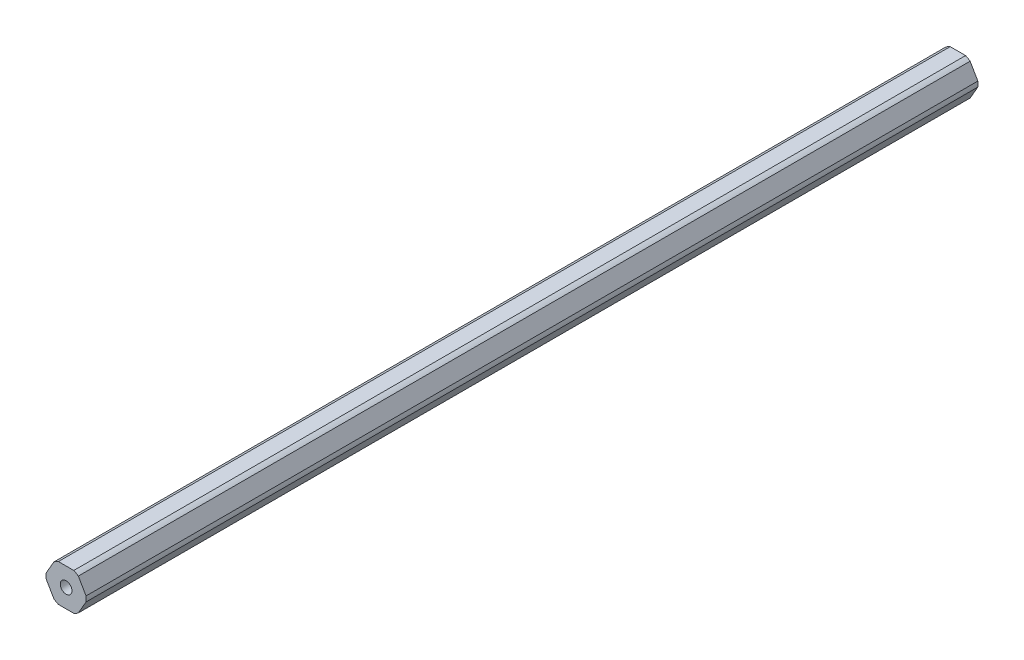
ISO-10303-21;
HEADER;
FILE_DESCRIPTION(('STEP AP214'),'2;1');
FILE_NAME('part.step','',(''),(''),'','','');
FILE_SCHEMA(('AUTOMOTIVE_DESIGN { 1 0 10303 214 1 1 1 1 }'));
ENDSEC;
DATA;
#1=APPLICATION_CONTEXT('core data for automotive mechanical design processes');
#2=APPLICATION_PROTOCOL_DEFINITION('international standard','automotive_design',2000,#1);
#3=PRODUCT_CONTEXT('',#1,'mechanical');
#4=PRODUCT('Part','Part','',(#3));
#5=PRODUCT_RELATED_PRODUCT_CATEGORY('part','',(#4));
#6=PRODUCT_DEFINITION_FORMATION('','',#4);
#7=PRODUCT_DEFINITION_CONTEXT('part definition',#1,'design');
#8=PRODUCT_DEFINITION('design','',#6,#7);
#9=PRODUCT_DEFINITION_SHAPE('','',#8);
#10=(LENGTH_UNIT() NAMED_UNIT(*) SI_UNIT(.MILLI.,.METRE.));
#11=(NAMED_UNIT(*) PLANE_ANGLE_UNIT() SI_UNIT($,.RADIAN.));
#12=(NAMED_UNIT(*) SI_UNIT($,.STERADIAN.) SOLID_ANGLE_UNIT());
#13=UNCERTAINTY_MEASURE_WITH_UNIT(LENGTH_MEASURE(1.E-05),#10,'distance_accuracy_value','');
#14=(GEOMETRIC_REPRESENTATION_CONTEXT(3) GLOBAL_UNCERTAINTY_ASSIGNED_CONTEXT((#13)) GLOBAL_UNIT_ASSIGNED_CONTEXT((#10,
#11,#12)) REPRESENTATION_CONTEXT('',''));
#15=CARTESIAN_POINT('',(0.,0.,0.));
#16=DIRECTION('',(0.,0.,1.));
#17=DIRECTION('',(1.,0.,0.));
#18=AXIS2_PLACEMENT_3D('',#15,#16,#17);
#19=CARTESIAN_POINT('',(5.49926131403118,3.175,152.4));
#20=DIRECTION('',(-0.866025403784439,-0.5,0.));
#21=DIRECTION('',(0.5,-0.866025403784438,0.));
#22=AXIS2_PLACEMENT_3D('',#19,#20,#21);
#23=PLANE('',#22);
#24=DIRECTION('',(-0.5,0.866025403784439,0.));
#25=VECTOR('',#24,1.);
#26=CARTESIAN_POINT('',(5.49926131403118,3.175,-152.4));
#27=LINE('',#26,#25);
#28=CARTESIAN_POINT('',(6.81675178197583,0.89303957103218,-152.4));
#29=VERTEX_POINT('',#28);
#30=CARTESIAN_POINT('',(4.18177084608654,5.45696042896782,-152.4));
#31=VERTEX_POINT('',#30);
#32=EDGE_CURVE('E164',#29,#31,#27,.T.);
#33=ORIENTED_EDGE('',*,*,#32,.T.);
#34=DIRECTION('',(0.,0.,-1.));
#35=VECTOR('',#34,1.);
#36=CARTESIAN_POINT('',(4.18177084608654,5.45696042896782,152.4));
#37=LINE('',#36,#35);
#38=CARTESIAN_POINT('',(4.18177084608654,5.45696042896782,152.4));
#39=VERTEX_POINT('',#38);
#40=EDGE_CURVE('E11',#39,#31,#37,.T.);
#41=ORIENTED_EDGE('',*,*,#40,.F.);
#42=DIRECTION('',(-0.5,0.866025403784439,0.));
#43=VECTOR('',#42,1.);
#44=CARTESIAN_POINT('',(5.49926131403118,3.175,152.4));
#45=LINE('',#44,#43);
#46=CARTESIAN_POINT('',(6.81675178197583,0.89303957103218,152.4));
#47=VERTEX_POINT('',#46);
#48=EDGE_CURVE('E223',#47,#39,#45,.T.);
#49=ORIENTED_EDGE('',*,*,#48,.F.);
#50=DIRECTION('',(0.,0.,-1.));
#51=VECTOR('',#50,1.);
#52=CARTESIAN_POINT('',(6.81675178197583,0.89303957103218,152.4));
#53=LINE('',#52,#51);
#54=EDGE_CURVE('E157',#47,#29,#53,.T.);
#55=ORIENTED_EDGE('',*,*,#54,.T.);
#56=EDGE_LOOP('',(#33,#41,#49,#55));
#57=FACE_BOUND('',#56,.T.);
#58=ADVANCED_FACE('F39',(#57),#23,.F.);
#59=CARTESIAN_POINT('',(0.,0.,152.4));
#60=DIRECTION('',(0.,0.,-1.));
#61=DIRECTION('',(-1.,0.,0.));
#62=AXIS2_PLACEMENT_3D('',#59,#60,#61);
#63=CYLINDRICAL_SURFACE('',#62,6.874999966);
#64=CARTESIAN_POINT('',(0.,0.,-152.4));
#65=DIRECTION('',(0.,0.,1.));
#66=DIRECTION('',(1.,0.,0.));
#67=AXIS2_PLACEMENT_3D('',#64,#65,#66);
#68=CIRCLE('',#67,6.874999966);
#69=CARTESIAN_POINT('',(2.63498093588929,6.35,-152.4));
#70=VERTEX_POINT('',#69);
#71=EDGE_CURVE('E167',#31,#70,#68,.T.);
#72=ORIENTED_EDGE('',*,*,#71,.T.);
#73=DIRECTION('',(0.,0.,-1.));
#74=VECTOR('',#73,1.);
#75=CARTESIAN_POINT('',(2.63498093588929,6.35,152.4));
#76=LINE('',#75,#74);
#77=CARTESIAN_POINT('',(2.63498093588929,6.35,152.4));
#78=VERTEX_POINT('',#77);
#79=EDGE_CURVE('E48',#78,#70,#76,.T.);
#80=ORIENTED_EDGE('',*,*,#79,.F.);
#81=CARTESIAN_POINT('',(0.,0.,152.4));
#82=DIRECTION('',(0.,0.,1.));
#83=DIRECTION('',(1.,0.,0.));
#84=AXIS2_PLACEMENT_3D('',#81,#82,#83);
#85=CIRCLE('',#84,6.874999966);
#86=EDGE_CURVE('E111',#39,#78,#85,.T.);
#87=ORIENTED_EDGE('',*,*,#86,.F.);
#88=ORIENTED_EDGE('',*,*,#40,.T.);
#89=EDGE_LOOP('',(#72,#80,#87,#88));
#90=FACE_BOUND('',#89,.T.);
#91=ADVANCED_FACE('F258',(#90),#63,.T.);
#92=CARTESIAN_POINT('',(0.,6.35,152.4));
#93=DIRECTION('',(0.,-1.,0.));
#94=DIRECTION('',(0.,0.,-1.));
#95=AXIS2_PLACEMENT_3D('',#92,#93,#94);
#96=PLANE('',#95);
#97=DIRECTION('',(-1.,0.,0.));
#98=VECTOR('',#97,1.);
#99=CARTESIAN_POINT('',(0.,6.35,-152.4));
#100=LINE('',#99,#98);
#101=CARTESIAN_POINT('',(-2.63498093588929,6.35,-152.4));
#102=VERTEX_POINT('',#101);
#103=EDGE_CURVE('E169',#70,#102,#100,.T.);
#104=ORIENTED_EDGE('',*,*,#103,.T.);
#105=DIRECTION('',(0.,0.,-1.));
#106=VECTOR('',#105,1.);
#107=CARTESIAN_POINT('',(-2.63498093588929,6.35,152.4));
#108=LINE('',#107,#106);
#109=CARTESIAN_POINT('',(-2.63498093588929,6.35,152.4));
#110=VERTEX_POINT('',#109);
#111=EDGE_CURVE('E199',#110,#102,#108,.T.);
#112=ORIENTED_EDGE('',*,*,#111,.F.);
#113=DIRECTION('',(-1.,0.,0.));
#114=VECTOR('',#113,1.);
#115=CARTESIAN_POINT('',(0.,6.35,152.4));
#116=LINE('',#115,#114);
#117=EDGE_CURVE('E207',#78,#110,#116,.T.);
#118=ORIENTED_EDGE('',*,*,#117,.F.);
#119=ORIENTED_EDGE('',*,*,#79,.T.);
#120=EDGE_LOOP('',(#104,#112,#118,#119));
#121=FACE_BOUND('',#120,.T.);
#122=ADVANCED_FACE('F205',(#121),#96,.F.);
#123=CARTESIAN_POINT('',(-4.18177084608654,5.45696042896783,-152.4));
#124=VERTEX_POINT('',#123);
#125=EDGE_CURVE('E170',#102,#124,#68,.T.);
#126=ORIENTED_EDGE('',*,*,#125,.T.);
#127=DIRECTION('',(0.,0.,-1.));
#128=VECTOR('',#127,1.);
#129=CARTESIAN_POINT('',(-4.18177084608654,5.45696042896783,152.4));
#130=LINE('',#129,#128);
#131=CARTESIAN_POINT('',(-4.18177084608654,5.45696042896783,152.4));
#132=VERTEX_POINT('',#131);
#133=EDGE_CURVE('E196',#132,#124,#130,.T.);
#134=ORIENTED_EDGE('',*,*,#133,.F.);
#135=EDGE_CURVE('E229',#110,#132,#85,.T.);
#136=ORIENTED_EDGE('',*,*,#135,.F.);
#137=ORIENTED_EDGE('',*,*,#111,.T.);
#138=EDGE_LOOP('',(#126,#134,#136,#137));
#139=FACE_BOUND('',#138,.T.);
#140=ADVANCED_FACE('F240',(#139),#63,.T.);
#141=CARTESIAN_POINT('',(-5.49926131403118,3.175,152.4));
#142=DIRECTION('',(0.866025403784438,-0.5,0.));
#143=DIRECTION('',(0.5,0.866025403784438,0.));
#144=AXIS2_PLACEMENT_3D('',#141,#142,#143);
#145=PLANE('',#144);
#146=DIRECTION('',(-0.5,-0.866025403784438,0.));
#147=VECTOR('',#146,1.);
#148=CARTESIAN_POINT('',(-5.49926131403118,3.175,-152.4));
#149=LINE('',#148,#147);
#150=CARTESIAN_POINT('',(-6.81675178197583,0.893039571032178,-152.4));
#151=VERTEX_POINT('',#150);
#152=EDGE_CURVE('E172',#124,#151,#149,.T.);
#153=ORIENTED_EDGE('',*,*,#152,.T.);
#154=DIRECTION('',(0.,0.,-1.));
#155=VECTOR('',#154,1.);
#156=CARTESIAN_POINT('',(-6.81675178197583,0.893039571032178,152.4));
#157=LINE('',#156,#155);
#158=CARTESIAN_POINT('',(-6.81675178197583,0.893039571032178,152.4));
#159=VERTEX_POINT('',#158);
#160=EDGE_CURVE('E193',#159,#151,#157,.T.);
#161=ORIENTED_EDGE('',*,*,#160,.F.);
#162=DIRECTION('',(-0.5,-0.866025403784438,0.));
#163=VECTOR('',#162,1.);
#164=CARTESIAN_POINT('',(-5.49926131403118,3.175,152.4));
#165=LINE('',#164,#163);
#166=EDGE_CURVE('E231',#132,#159,#165,.T.);
#167=ORIENTED_EDGE('',*,*,#166,.F.);
#168=ORIENTED_EDGE('',*,*,#133,.T.);
#169=EDGE_LOOP('',(#153,#161,#167,#168));
#170=FACE_BOUND('',#169,.T.);
#171=ADVANCED_FACE('F242',(#170),#145,.F.);
#172=CARTESIAN_POINT('',(-6.81675178197583,-0.893039571032174,-152.4));
#173=VERTEX_POINT('',#172);
#174=EDGE_CURVE('E174',#151,#173,#68,.T.);
#175=ORIENTED_EDGE('',*,*,#174,.T.);
#176=DIRECTION('',(0.,0.,-1.));
#177=VECTOR('',#176,1.);
#178=CARTESIAN_POINT('',(-6.81675178197583,-0.893039571032174,152.4));
#179=LINE('',#178,#177);
#180=CARTESIAN_POINT('',(-6.81675178197583,-0.893039571032174,152.4));
#181=VERTEX_POINT('',#180);
#182=EDGE_CURVE('E190',#181,#173,#179,.T.);
#183=ORIENTED_EDGE('',*,*,#182,.F.);
#184=EDGE_CURVE('E232',#159,#181,#85,.T.);
#185=ORIENTED_EDGE('',*,*,#184,.F.);
#186=ORIENTED_EDGE('',*,*,#160,.T.);
#187=EDGE_LOOP('',(#175,#183,#185,#186));
#188=FACE_BOUND('',#187,.T.);
#189=ADVANCED_FACE('F243',(#188),#63,.T.);
#190=CARTESIAN_POINT('',(-5.49926131403118,-3.175,152.4));
#191=DIRECTION('',(0.866025403784438,0.5,0.));
#192=DIRECTION('',(-0.5,0.866025403784438,0.));
#193=AXIS2_PLACEMENT_3D('',#190,#191,#192);
#194=PLANE('',#193);
#195=DIRECTION('',(0.5,-0.866025403784438,0.));
#196=VECTOR('',#195,1.);
#197=CARTESIAN_POINT('',(-5.49926131403118,-3.175,-152.4));
#198=LINE('',#197,#196);
#199=CARTESIAN_POINT('',(-4.18177084608653,-5.45696042896783,-152.4));
#200=VERTEX_POINT('',#199);
#201=EDGE_CURVE('E175',#173,#200,#198,.T.);
#202=ORIENTED_EDGE('',*,*,#201,.T.);
#203=DIRECTION('',(0.,0.,-1.));
#204=VECTOR('',#203,1.);
#205=CARTESIAN_POINT('',(-4.18177084608653,-5.45696042896783,152.4));
#206=LINE('',#205,#204);
#207=CARTESIAN_POINT('',(-4.18177084608653,-5.45696042896783,152.4));
#208=VERTEX_POINT('',#207);
#209=EDGE_CURVE('E187',#208,#200,#206,.T.);
#210=ORIENTED_EDGE('',*,*,#209,.F.);
#211=DIRECTION('',(0.5,-0.866025403784438,0.));
#212=VECTOR('',#211,1.);
#213=CARTESIAN_POINT('',(-5.49926131403118,-3.175,152.4));
#214=LINE('',#213,#212);
#215=EDGE_CURVE('E233',#181,#208,#214,.T.);
#216=ORIENTED_EDGE('',*,*,#215,.F.);
#217=ORIENTED_EDGE('',*,*,#182,.T.);
#218=EDGE_LOOP('',(#202,#210,#216,#217));
#219=FACE_BOUND('',#218,.T.);
#220=ADVANCED_FACE('F246',(#219),#194,.F.);
#221=CARTESIAN_POINT('',(-2.6349809358893,-6.35,-152.4));
#222=VERTEX_POINT('',#221);
#223=EDGE_CURVE('E177',#200,#222,#68,.T.);
#224=ORIENTED_EDGE('',*,*,#223,.T.);
#225=DIRECTION('',(0.,0.,-1.));
#226=VECTOR('',#225,1.);
#227=CARTESIAN_POINT('',(-2.6349809358893,-6.35,152.4));
#228=LINE('',#227,#226);
#229=CARTESIAN_POINT('',(-2.6349809358893,-6.35,152.4));
#230=VERTEX_POINT('',#229);
#231=EDGE_CURVE('E184',#230,#222,#228,.T.);
#232=ORIENTED_EDGE('',*,*,#231,.F.);
#233=EDGE_CURVE('E147',#208,#230,#85,.T.);
#234=ORIENTED_EDGE('',*,*,#233,.F.);
#235=ORIENTED_EDGE('',*,*,#209,.T.);
#236=EDGE_LOOP('',(#224,#232,#234,#235));
#237=FACE_BOUND('',#236,.T.);
#238=ADVANCED_FACE('F248',(#237),#63,.T.);
#239=CARTESIAN_POINT('',(0.,-6.35,152.4));
#240=DIRECTION('',(0.,1.,0.));
#241=DIRECTION('',(0.,0.,1.));
#242=AXIS2_PLACEMENT_3D('',#239,#240,#241);
#243=PLANE('',#242);
#244=DIRECTION('',(1.,0.,0.));
#245=VECTOR('',#244,1.);
#246=CARTESIAN_POINT('',(0.,-6.35,-152.4));
#247=LINE('',#246,#245);
#248=CARTESIAN_POINT('',(2.6349809358893,-6.35,-152.4));
#249=VERTEX_POINT('',#248);
#250=EDGE_CURVE('E178',#222,#249,#247,.T.);
#251=ORIENTED_EDGE('',*,*,#250,.T.);
#252=DIRECTION('',(0.,0.,-1.));
#253=VECTOR('',#252,1.);
#254=CARTESIAN_POINT('',(2.6349809358893,-6.35,152.4));
#255=LINE('',#254,#253);
#256=CARTESIAN_POINT('',(2.6349809358893,-6.35,152.4));
#257=VERTEX_POINT('',#256);
#258=EDGE_CURVE('E152',#257,#249,#255,.T.);
#259=ORIENTED_EDGE('',*,*,#258,.F.);
#260=DIRECTION('',(1.,0.,0.));
#261=VECTOR('',#260,1.);
#262=CARTESIAN_POINT('',(0.,-6.35,152.4));
#263=LINE('',#262,#261);
#264=EDGE_CURVE('E142',#230,#257,#263,.T.);
#265=ORIENTED_EDGE('',*,*,#264,.F.);
#266=ORIENTED_EDGE('',*,*,#231,.T.);
#267=EDGE_LOOP('',(#251,#259,#265,#266));
#268=FACE_BOUND('',#267,.T.);
#269=ADVANCED_FACE('F251',(#268),#243,.F.);
#270=CARTESIAN_POINT('',(4.18177084608654,-5.45696042896782,-152.4));
#271=VERTEX_POINT('',#270);
#272=EDGE_CURVE('E151',#249,#271,#68,.T.);
#273=ORIENTED_EDGE('',*,*,#272,.T.);
#274=DIRECTION('',(0.,0.,-1.));
#275=VECTOR('',#274,1.);
#276=CARTESIAN_POINT('',(4.18177084608654,-5.45696042896782,152.4));
#277=LINE('',#276,#275);
#278=CARTESIAN_POINT('',(4.18177084608654,-5.45696042896782,152.4));
#279=VERTEX_POINT('',#278);
#280=EDGE_CURVE('E148',#279,#271,#277,.T.);
#281=ORIENTED_EDGE('',*,*,#280,.F.);
#282=EDGE_CURVE('E136',#257,#279,#85,.T.);
#283=ORIENTED_EDGE('',*,*,#282,.F.);
#284=ORIENTED_EDGE('',*,*,#258,.T.);
#285=EDGE_LOOP('',(#273,#281,#283,#284));
#286=FACE_BOUND('',#285,.T.);
#287=ADVANCED_FACE('F149',(#286),#63,.T.);
#288=CARTESIAN_POINT('',(5.49926131403119,-3.175,152.4));
#289=DIRECTION('',(-0.866025403784439,0.5,0.));
#290=DIRECTION('',(-0.5,-0.866025403784439,0.));
#291=AXIS2_PLACEMENT_3D('',#288,#289,#290);
#292=PLANE('',#291);
#293=DIRECTION('',(0.5,0.866025403784439,0.));
#294=VECTOR('',#293,1.);
#295=CARTESIAN_POINT('',(5.49926131403119,-3.175,-152.4));
#296=LINE('',#295,#294);
#297=CARTESIAN_POINT('',(6.81675178197583,-0.893039571032182,-152.4));
#298=VERTEX_POINT('',#297);
#299=EDGE_CURVE('E97',#271,#298,#296,.T.);
#300=ORIENTED_EDGE('',*,*,#299,.T.);
#301=DIRECTION('',(0.,0.,-1.));
#302=VECTOR('',#301,1.);
#303=CARTESIAN_POINT('',(6.81675178197583,-0.893039571032182,152.4));
#304=LINE('',#303,#302);
#305=CARTESIAN_POINT('',(6.81675178197583,-0.893039571032182,152.4));
#306=VERTEX_POINT('',#305);
#307=EDGE_CURVE('E153',#306,#298,#304,.T.);
#308=ORIENTED_EDGE('',*,*,#307,.F.);
#309=DIRECTION('',(0.5,0.866025403784439,0.));
#310=VECTOR('',#309,1.);
#311=CARTESIAN_POINT('',(5.49926131403119,-3.175,152.4));
#312=LINE('',#311,#310);
#313=EDGE_CURVE('E140',#279,#306,#312,.T.);
#314=ORIENTED_EDGE('',*,*,#313,.F.);
#315=ORIENTED_EDGE('',*,*,#280,.T.);
#316=EDGE_LOOP('',(#300,#308,#314,#315));
#317=FACE_BOUND('',#316,.T.);
#318=ADVANCED_FACE('F155',(#317),#292,.F.);
#319=CARTESIAN_POINT('',(0.,0.,152.4));
#320=DIRECTION('',(0.,0.,-1.));
#321=DIRECTION('',(-1.,0.,0.));
#322=AXIS2_PLACEMENT_3D('',#319,#320,#321);
#323=CYLINDRICAL_SURFACE('',#322,2.000000064);
#324=CARTESIAN_POINT('',(0.,0.,152.4));
#325=DIRECTION('',(0.,0.,1.));
#326=DIRECTION('',(1.,0.,0.));
#327=AXIS2_PLACEMENT_3D('',#324,#325,#326);
#328=CIRCLE('',#327,2.000000064);
#329=CARTESIAN_POINT('',(-2.000000064,0.,152.4));
#330=VERTEX_POINT('',#329);
#331=EDGE_CURVE('E221',#330,#330,#328,.T.);
#332=CARTESIAN_POINT('',(0.,0.,-152.4));
#333=DIRECTION('',(0.,0.,1.));
#334=DIRECTION('',(1.,0.,0.));
#335=AXIS2_PLACEMENT_3D('',#332,#333,#334);
#336=CIRCLE('',#335,2.000000064);
#337=CARTESIAN_POINT('',(-2.000000064,0.,-152.4));
#338=VERTEX_POINT('',#337);
#339=EDGE_CURVE('E161',#338,#338,#336,.T.);
#340=CARTESIAN_POINT('',(-2.000000064,0.,152.4));
#341=CARTESIAN_POINT('',(-2.000000064,0.,149.225));
#342=CARTESIAN_POINT('',(-2.000000064,0.,146.05));
#343=CARTESIAN_POINT('',(-2.000000064,0.,139.7));
#344=CARTESIAN_POINT('',(-2.000000064,0.,136.525));
#345=CARTESIAN_POINT('',(-2.000000064,0.,130.175));
#346=CARTESIAN_POINT('',(-2.000000064,0.,127.));
#347=CARTESIAN_POINT('',(-2.000000064,0.,120.65));
#348=CARTESIAN_POINT('',(-2.000000064,0.,117.475));
#349=CARTESIAN_POINT('',(-2.000000064,0.,111.125));
#350=CARTESIAN_POINT('',(-2.000000064,0.,107.95));
#351=CARTESIAN_POINT('',(-2.000000064,0.,101.6));
#352=CARTESIAN_POINT('',(-2.000000064,0.,98.425));
#353=CARTESIAN_POINT('',(-2.000000064,0.,92.075));
#354=CARTESIAN_POINT('',(-2.000000064,0.,88.9));
#355=CARTESIAN_POINT('',(-2.000000064,0.,82.55));
#356=CARTESIAN_POINT('',(-2.000000064,0.,79.375));
#357=CARTESIAN_POINT('',(-2.000000064,0.,73.025));
#358=CARTESIAN_POINT('',(-2.000000064,0.,69.85));
#359=CARTESIAN_POINT('',(-2.000000064,0.,63.5));
#360=CARTESIAN_POINT('',(-2.000000064,0.,60.325));
#361=CARTESIAN_POINT('',(-2.000000064,0.,53.975));
#362=CARTESIAN_POINT('',(-2.000000064,0.,50.8));
#363=CARTESIAN_POINT('',(-2.000000064,0.,44.45));
#364=CARTESIAN_POINT('',(-2.000000064,0.,41.275));
#365=CARTESIAN_POINT('',(-2.000000064,0.,34.925));
#366=CARTESIAN_POINT('',(-2.000000064,0.,31.75));
#367=CARTESIAN_POINT('',(-2.000000064,0.,25.4));
#368=CARTESIAN_POINT('',(-2.000000064,0.,22.225));
#369=CARTESIAN_POINT('',(-2.000000064,0.,15.875));
#370=CARTESIAN_POINT('',(-2.000000064,0.,12.7));
#371=CARTESIAN_POINT('',(-2.000000064,0.,6.35));
#372=CARTESIAN_POINT('',(-2.000000064,0.,3.175));
#373=CARTESIAN_POINT('',(-2.000000064,0.,-3.175));
#374=CARTESIAN_POINT('',(-2.000000064,0.,-6.35));
#375=CARTESIAN_POINT('',(-2.000000064,0.,-12.7));
#376=CARTESIAN_POINT('',(-2.000000064,0.,-15.875));
#377=CARTESIAN_POINT('',(-2.000000064,0.,-22.225));
#378=CARTESIAN_POINT('',(-2.000000064,0.,-25.4));
#379=CARTESIAN_POINT('',(-2.000000064,0.,-31.75));
#380=CARTESIAN_POINT('',(-2.000000064,0.,-34.925));
#381=CARTESIAN_POINT('',(-2.000000064,0.,-41.275));
#382=CARTESIAN_POINT('',(-2.000000064,0.,-44.45));
#383=CARTESIAN_POINT('',(-2.000000064,0.,-50.8));
#384=CARTESIAN_POINT('',(-2.000000064,0.,-53.975));
#385=CARTESIAN_POINT('',(-2.000000064,0.,-60.325));
#386=CARTESIAN_POINT('',(-2.000000064,0.,-63.5));
#387=CARTESIAN_POINT('',(-2.000000064,0.,-69.85));
#388=CARTESIAN_POINT('',(-2.000000064,0.,-73.025));
#389=CARTESIAN_POINT('',(-2.000000064,0.,-79.375));
#390=CARTESIAN_POINT('',(-2.000000064,0.,-82.55));
#391=CARTESIAN_POINT('',(-2.000000064,0.,-88.9));
#392=CARTESIAN_POINT('',(-2.000000064,0.,-92.075));
#393=CARTESIAN_POINT('',(-2.000000064,0.,-98.425));
#394=CARTESIAN_POINT('',(-2.000000064,0.,-101.6));
#395=CARTESIAN_POINT('',(-2.000000064,0.,-107.95));
#396=CARTESIAN_POINT('',(-2.000000064,0.,-111.125));
#397=CARTESIAN_POINT('',(-2.000000064,0.,-117.475));
#398=CARTESIAN_POINT('',(-2.000000064,0.,-120.65));
#399=CARTESIAN_POINT('',(-2.000000064,0.,-127.));
#400=CARTESIAN_POINT('',(-2.000000064,0.,-130.175));
#401=CARTESIAN_POINT('',(-2.000000064,0.,-136.525));
#402=CARTESIAN_POINT('',(-2.000000064,0.,-139.7));
#403=CARTESIAN_POINT('',(-2.000000064,0.,-146.05));
#404=CARTESIAN_POINT('',(-2.000000064,0.,-149.225));
#405=CARTESIAN_POINT('',(-2.000000064,0.,-152.4));
#406=B_SPLINE_CURVE_WITH_KNOTS('',3,(#340,#341,#342,#343,#344,#345,#346,#347,#348,#349,#350,
#351,#352,#353,#354,#355,#356,#357,#358,#359,#360,#361,#362,#363,#364,#365,#366,#367,#368,#369,
#370,#371,#372,#373,#374,#375,#376,#377,#378,#379,#380,#381,#382,#383,#384,#385,#386,#387,#388,
#389,#390,#391,#392,#393,#394,#395,#396,#397,#398,#399,#400,#401,#402,#403,#404,#405),
.UNSPECIFIED.,.F.,.F.,(4,2,2,2,2,2,2,2,2,2,2,2,2,2,2,2,2,2,2,2,2,2,2,2,2,2,2,2,2,2,2,2,4),(0.,
9.52500000000001,19.05,28.575,38.1,47.625,57.15,66.675,76.2,85.725,95.25,104.775,114.3,123.825,
133.35,142.875,152.4,161.925,171.45,180.975,190.5,200.025,209.55,219.075,228.6,238.125,247.65,
257.175,266.7,276.225,285.75,295.275,304.8),.UNSPECIFIED.);
#407=EDGE_CURVE('BSEAM41',#330,#338,#406,.T.);
#408=ORIENTED_EDGE('',*,*,#331,.T.);
#409=ORIENTED_EDGE('',*,*,#339,.F.);
#410=ORIENTED_EDGE('',*,*,#407,.T.);
#411=ORIENTED_EDGE('',*,*,#407,.F.);
#412=EDGE_LOOP('',(#408,#410,#409,#411));
#413=FACE_BOUND('',#412,.T.);
#414=ADVANCED_FACE('F41',(#413),#323,.F.);
#415=EDGE_CURVE('E103',#298,#29,#68,.T.);
#416=ORIENTED_EDGE('',*,*,#415,.T.);
#417=ORIENTED_EDGE('',*,*,#54,.F.);
#418=EDGE_CURVE('E56',#306,#47,#85,.T.);
#419=ORIENTED_EDGE('',*,*,#418,.F.);
#420=ORIENTED_EDGE('',*,*,#307,.T.);
#421=EDGE_LOOP('',(#416,#417,#419,#420));
#422=FACE_BOUND('',#421,.T.);
#423=ADVANCED_FACE('F255',(#422),#63,.T.);
#424=CARTESIAN_POINT('',(0.,0.,152.4));
#425=DIRECTION('',(0.,0.,1.));
#426=DIRECTION('',(1.,0.,0.));
#427=AXIS2_PLACEMENT_3D('',#424,#425,#426);
#428=PLANE('',#427);
#429=ORIENTED_EDGE('',*,*,#331,.F.);
#430=EDGE_LOOP('',(#429));
#431=FACE_BOUND('',#430,.T.);
#432=ORIENTED_EDGE('',*,*,#48,.T.);
#433=ORIENTED_EDGE('',*,*,#86,.T.);
#434=ORIENTED_EDGE('',*,*,#117,.T.);
#435=ORIENTED_EDGE('',*,*,#135,.T.);
#436=ORIENTED_EDGE('',*,*,#166,.T.);
#437=ORIENTED_EDGE('',*,*,#184,.T.);
#438=ORIENTED_EDGE('',*,*,#215,.T.);
#439=ORIENTED_EDGE('',*,*,#233,.T.);
#440=ORIENTED_EDGE('',*,*,#264,.T.);
#441=ORIENTED_EDGE('',*,*,#282,.T.);
#442=ORIENTED_EDGE('',*,*,#313,.T.);
#443=ORIENTED_EDGE('',*,*,#418,.T.);
#444=EDGE_LOOP('',(#432,#433,#434,#435,#436,#437,#438,#439,#440,#441,#442,#443));
#445=FACE_BOUND('',#444,.T.);
#446=ADVANCED_FACE('F138',(#431,#445),#428,.T.);
#447=CARTESIAN_POINT('',(0.,0.,-152.4));
#448=DIRECTION('',(0.,0.,1.));
#449=DIRECTION('',(1.,0.,0.));
#450=AXIS2_PLACEMENT_3D('',#447,#448,#449);
#451=PLANE('',#450);
#452=ORIENTED_EDGE('',*,*,#339,.T.);
#453=EDGE_LOOP('',(#452));
#454=FACE_BOUND('',#453,.T.);
#455=ORIENTED_EDGE('',*,*,#32,.F.);
#456=ORIENTED_EDGE('',*,*,#415,.F.);
#457=ORIENTED_EDGE('',*,*,#299,.F.);
#458=ORIENTED_EDGE('',*,*,#272,.F.);
#459=ORIENTED_EDGE('',*,*,#250,.F.);
#460=ORIENTED_EDGE('',*,*,#223,.F.);
#461=ORIENTED_EDGE('',*,*,#201,.F.);
#462=ORIENTED_EDGE('',*,*,#174,.F.);
#463=ORIENTED_EDGE('',*,*,#152,.F.);
#464=ORIENTED_EDGE('',*,*,#125,.F.);
#465=ORIENTED_EDGE('',*,*,#103,.F.);
#466=ORIENTED_EDGE('',*,*,#71,.F.);
#467=EDGE_LOOP('',(#455,#456,#457,#458,#459,#460,#461,#462,#463,#464,#465,#466));
#468=FACE_BOUND('',#467,.T.);
#469=ADVANCED_FACE('F211',(#454,#468),#451,.F.);
#470=CLOSED_SHELL('',(#58,#91,#122,#140,#171,#189,#220,#238,#269,#287,#318,#414,#423,#446,#469));
#471=MANIFOLD_SOLID_BREP('B2',#470);
#472=ADVANCED_BREP_SHAPE_REPRESENTATION('',(#18,#471),#14);
#473=SHAPE_DEFINITION_REPRESENTATION(#9,#472);
ENDSEC;
END-ISO-10303-21;
